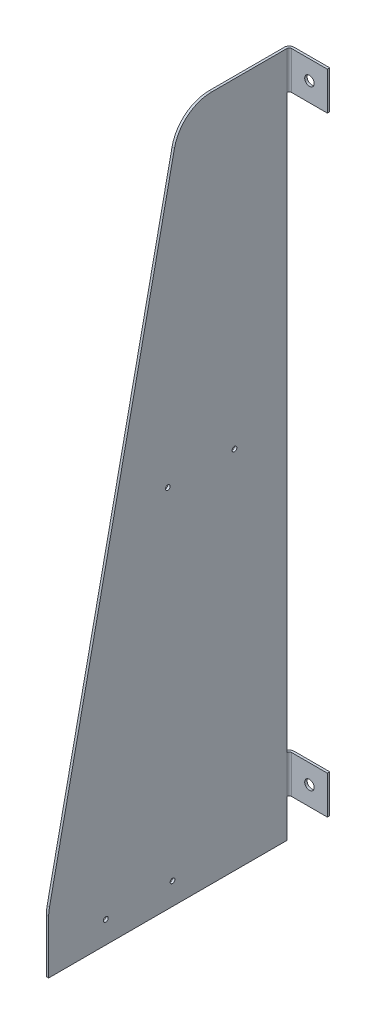
ISO-10303-21;
HEADER;
FILE_DESCRIPTION(('STEP AP214'),'2;1');
FILE_NAME('part.step','',(''),(''),'','','');
FILE_SCHEMA(('AUTOMOTIVE_DESIGN { 1 0 10303 214 1 1 1 1 }'));
ENDSEC;
DATA;
#1=APPLICATION_CONTEXT('core data for automotive mechanical design processes');
#2=APPLICATION_PROTOCOL_DEFINITION('international standard','automotive_design',2000,#1);
#3=PRODUCT_CONTEXT('',#1,'mechanical');
#4=PRODUCT('Part','Part','',(#3));
#5=PRODUCT_RELATED_PRODUCT_CATEGORY('part','',(#4));
#6=PRODUCT_DEFINITION_FORMATION('','',#4);
#7=PRODUCT_DEFINITION_CONTEXT('part definition',#1,'design');
#8=PRODUCT_DEFINITION('design','',#6,#7);
#9=PRODUCT_DEFINITION_SHAPE('','',#8);
#10=(LENGTH_UNIT() NAMED_UNIT(*) SI_UNIT(.MILLI.,.METRE.));
#11=(NAMED_UNIT(*) PLANE_ANGLE_UNIT() SI_UNIT($,.RADIAN.));
#12=(NAMED_UNIT(*) SI_UNIT($,.STERADIAN.) SOLID_ANGLE_UNIT());
#13=UNCERTAINTY_MEASURE_WITH_UNIT(LENGTH_MEASURE(1.E-05),#10,'distance_accuracy_value','');
#14=(GEOMETRIC_REPRESENTATION_CONTEXT(3) GLOBAL_UNCERTAINTY_ASSIGNED_CONTEXT((#13)) GLOBAL_UNIT_ASSIGNED_CONTEXT((#10,
#11,#12)) REPRESENTATION_CONTEXT('',''));
#15=CARTESIAN_POINT('',(0.,0.,0.));
#16=DIRECTION('',(0.,0.,1.));
#17=DIRECTION('',(1.,0.,0.));
#18=AXIS2_PLACEMENT_3D('',#15,#16,#17);
#19=CARTESIAN_POINT('',(3.175,0.,0.));
#20=DIRECTION('',(1.,0.,0.));
#21=DIRECTION('',(0.,0.,-1.));
#22=AXIS2_PLACEMENT_3D('',#19,#20,#21);
#23=PLANE('',#22);
#24=CARTESIAN_POINT('',(3.175,486.804131036418,69.85));
#25=DIRECTION('',(1.,0.,0.));
#26=DIRECTION('',(0.,0.,-1.));
#27=AXIS2_PLACEMENT_3D('',#24,#25,#26);
#28=CIRCLE('',#27,3.175);
#29=CARTESIAN_POINT('',(3.175,486.804131036418,66.675));
#30=VERTEX_POINT('',#29);
#31=EDGE_CURVE('E232',#30,#30,#28,.T.);
#32=ORIENTED_EDGE('',*,*,#31,.F.);
#33=EDGE_LOOP('',(#32));
#34=FACE_BOUND('',#33,.T.);
#35=CARTESIAN_POINT('',(3.175,29.604131036418,152.4));
#36=DIRECTION('',(1.,0.,0.));
#37=DIRECTION('',(0.,0.,-1.));
#38=AXIS2_PLACEMENT_3D('',#35,#36,#37);
#39=CIRCLE('',#38,3.175);
#40=CARTESIAN_POINT('',(3.175,29.604131036418,149.225));
#41=VERTEX_POINT('',#40);
#42=EDGE_CURVE('E236',#41,#41,#39,.T.);
#43=ORIENTED_EDGE('',*,*,#42,.F.);
#44=EDGE_LOOP('',(#43));
#45=FACE_BOUND('',#44,.T.);
#46=CARTESIAN_POINT('',(3.175,486.804131036418,158.75));
#47=DIRECTION('',(1.,0.,0.));
#48=DIRECTION('',(0.,0.,-1.));
#49=AXIS2_PLACEMENT_3D('',#46,#47,#48);
#50=CIRCLE('',#49,3.17499999999997);
#51=CARTESIAN_POINT('',(3.175,486.804131036418,155.575));
#52=VERTEX_POINT('',#51);
#53=EDGE_CURVE('E241',#52,#52,#50,.T.);
#54=ORIENTED_EDGE('',*,*,#53,.F.);
#55=EDGE_LOOP('',(#54));
#56=FACE_BOUND('',#55,.T.);
#57=CARTESIAN_POINT('',(3.175,29.604131036418,241.3));
#58=DIRECTION('',(1.,0.,0.));
#59=DIRECTION('',(0.,0.,-1.));
#60=AXIS2_PLACEMENT_3D('',#57,#58,#59);
#61=CIRCLE('',#60,3.17499999999997);
#62=CARTESIAN_POINT('',(3.175,29.604131036418,238.125));
#63=VERTEX_POINT('',#62);
#64=EDGE_CURVE('E276',#63,#63,#61,.T.);
#65=ORIENTED_EDGE('',*,*,#64,.F.);
#66=EDGE_LOOP('',(#65));
#67=FACE_BOUND('',#66,.T.);
#68=DIRECTION('',(0.,-1.,0.));
#69=VECTOR('',#68,1.);
#70=CARTESIAN_POINT('',(3.175,0.,-1.05760497574365E-13));
#71=LINE('',#70,#69);
#72=CARTESIAN_POINT('',(3.175,863.6,0.));
#73=VERTEX_POINT('',#72);
#74=CARTESIAN_POINT('',(3.175,101.6,0.));
#75=VERTEX_POINT('',#74);
#76=EDGE_CURVE('E268',#73,#75,#71,.T.);
#77=ORIENTED_EDGE('',*,*,#76,.F.);
#78=DIRECTION('',(0.,-1.,0.));
#79=VECTOR('',#78,1.);
#80=CARTESIAN_POINT('',(3.175,0.,0.));
#81=LINE('',#80,#79);
#82=CARTESIAN_POINT('',(3.175,914.4,0.));
#83=VERTEX_POINT('',#82);
#84=EDGE_CURVE('E368',#73,#83,#81,.F.);
#85=ORIENTED_EDGE('',*,*,#84,.T.);
#86=DIRECTION('',(0.,0.,-1.));
#87=VECTOR('',#86,1.);
#88=CARTESIAN_POINT('',(3.175,914.4,0.));
#89=LINE('',#88,#87);
#90=CARTESIAN_POINT('',(3.175,914.4,100.150182784968));
#91=VERTEX_POINT('',#90);
#92=EDGE_CURVE('E272',#91,#83,#89,.T.);
#93=ORIENTED_EDGE('',*,*,#92,.F.);
#94=CARTESIAN_POINT('',(3.175,863.6,100.150182784968));
#95=DIRECTION('',(1.,0.,0.));
#96=DIRECTION('',(0.,0.,-1.));
#97=AXIS2_PLACEMENT_3D('',#94,#95,#96);
#98=CIRCLE('',#97,50.8);
#99=CARTESIAN_POINT('',(3.175,874.045513000825,149.864680249487));
#100=VERTEX_POINT('',#99);
#101=EDGE_CURVE('E245',#100,#91,#98,.F.);
#102=ORIENTED_EDGE('',*,*,#101,.F.);
#103=DIRECTION('',(0.,-0.97863183985272,0.205620334661924));
#104=VECTOR('',#103,1.);
#105=CARTESIAN_POINT('',(3.175,67.1111623571902,319.409655665897));
#106=LINE('',#105,#104);
#107=CARTESIAN_POINT('',(3.175,81.3663535379903,316.414497464518));
#108=VERTEX_POINT('',#107);
#109=EDGE_CURVE('E249',#100,#108,#106,.T.);
#110=ORIENTED_EDGE('',*,*,#109,.T.);
#111=CARTESIAN_POINT('',(3.175,70.9208405371646,266.7));
#112=DIRECTION('',(1.,0.,0.));
#113=DIRECTION('',(0.,0.,-1.));
#114=AXIS2_PLACEMENT_3D('',#111,#112,#113);
#115=CIRCLE('',#114,50.8);
#116=CARTESIAN_POINT('',(3.175,70.9208405371646,317.5));
#117=VERTEX_POINT('',#116);
#118=EDGE_CURVE('E252',#117,#108,#115,.F.);
#119=ORIENTED_EDGE('',*,*,#118,.F.);
#120=DIRECTION('',(0.,1.,0.));
#121=VECTOR('',#120,1.);
#122=CARTESIAN_POINT('',(3.175,0.,317.5));
#123=LINE('',#122,#121);
#124=CARTESIAN_POINT('',(3.175,0.,317.5));
#125=VERTEX_POINT('',#124);
#126=EDGE_CURVE('E256',#125,#117,#123,.T.);
#127=ORIENTED_EDGE('',*,*,#126,.F.);
#128=DIRECTION('',(0.,0.,1.));
#129=VECTOR('',#128,1.);
#130=CARTESIAN_POINT('',(3.175,0.,0.));
#131=LINE('',#130,#129);
#132=CARTESIAN_POINT('',(3.175,0.,0.));
#133=VERTEX_POINT('',#132);
#134=EDGE_CURVE('E260',#133,#125,#131,.T.);
#135=ORIENTED_EDGE('',*,*,#134,.F.);
#136=DIRECTION('',(0.,1.,0.));
#137=VECTOR('',#136,1.);
#138=CARTESIAN_POINT('',(3.175,0.,0.));
#139=LINE('',#138,#137);
#140=CARTESIAN_POINT('',(3.175,50.8,0.));
#141=VERTEX_POINT('',#140);
#142=EDGE_CURVE('E264',#133,#141,#139,.T.);
#143=ORIENTED_EDGE('',*,*,#142,.T.);
#144=DIRECTION('',(0.,-1.,0.));
#145=VECTOR('',#144,1.);
#146=CARTESIAN_POINT('',(3.175,0.,0.));
#147=LINE('',#146,#145);
#148=EDGE_CURVE('E365',#141,#75,#147,.F.);
#149=ORIENTED_EDGE('',*,*,#148,.T.);
#150=EDGE_LOOP('',(#77,#85,#93,#102,#110,#119,#127,#135,#143,#149));
#151=FACE_BOUND('',#150,.T.);
#152=ADVANCED_FACE('F49',(#34,#45,#56,#67,#151),#23,.T.);
#153=CARTESIAN_POINT('',(3.175,863.6,100.150182784968));
#154=DIRECTION('',(-1.,0.,0.));
#155=DIRECTION('',(0.,0.,1.));
#156=AXIS2_PLACEMENT_3D('',#153,#154,#155);
#157=CYLINDRICAL_SURFACE('',#156,50.8);
#158=CARTESIAN_POINT('',(0.,863.6,100.150182784968));
#159=DIRECTION('',(1.,0.,0.));
#160=DIRECTION('',(0.,0.,-1.));
#161=AXIS2_PLACEMENT_3D('',#158,#159,#160);
#162=CIRCLE('',#161,50.8);
#163=CARTESIAN_POINT('',(0.,874.045513000825,149.864680249487));
#164=VERTEX_POINT('',#163);
#165=CARTESIAN_POINT('',(0.,914.4,100.150182784968));
#166=VERTEX_POINT('',#165);
#167=EDGE_CURVE('E292',#164,#166,#162,.F.);
#168=ORIENTED_EDGE('',*,*,#167,.F.);
#169=DIRECTION('',(-1.,0.,0.));
#170=VECTOR('',#169,1.);
#171=CARTESIAN_POINT('',(3.175,874.045513000825,149.864680249487));
#172=LINE('',#171,#170);
#173=EDGE_CURVE('E358',#100,#164,#172,.T.);
#174=ORIENTED_EDGE('',*,*,#173,.F.);
#175=ORIENTED_EDGE('',*,*,#101,.T.);
#176=DIRECTION('',(-1.,0.,0.));
#177=VECTOR('',#176,1.);
#178=CARTESIAN_POINT('',(3.175,914.4,100.150182784968));
#179=LINE('',#178,#177);
#180=EDGE_CURVE('E280',#91,#166,#179,.T.);
#181=ORIENTED_EDGE('',*,*,#180,.T.);
#182=EDGE_LOOP('',(#168,#174,#175,#181));
#183=FACE_BOUND('',#182,.T.);
#184=ADVANCED_FACE('F624',(#183),#157,.T.);
#185=CARTESIAN_POINT('',(3.175,67.1111623571902,319.409655665897));
#186=DIRECTION('',(0.,-0.205620334661924,-0.978631839852719));
#187=DIRECTION('',(0.,0.97863183985272,-0.205620334661924));
#188=AXIS2_PLACEMENT_3D('',#185,#186,#187);
#189=PLANE('',#188);
#190=DIRECTION('',(0.,-0.97863183985272,0.205620334661924));
#191=VECTOR('',#190,1.);
#192=CARTESIAN_POINT('',(0.,67.1111623571902,319.409655665897));
#193=LINE('',#192,#191);
#194=CARTESIAN_POINT('',(0.,81.3663535379903,316.414497464518));
#195=VERTEX_POINT('',#194);
#196=EDGE_CURVE('E296',#164,#195,#193,.T.);
#197=ORIENTED_EDGE('',*,*,#196,.T.);
#198=DIRECTION('',(-1.,0.,0.));
#199=VECTOR('',#198,1.);
#200=CARTESIAN_POINT('',(3.175,81.3663535379903,316.414497464518));
#201=LINE('',#200,#199);
#202=EDGE_CURVE('E355',#108,#195,#201,.T.);
#203=ORIENTED_EDGE('',*,*,#202,.F.);
#204=ORIENTED_EDGE('',*,*,#109,.F.);
#205=ORIENTED_EDGE('',*,*,#173,.T.);
#206=EDGE_LOOP('',(#197,#203,#204,#205));
#207=FACE_BOUND('',#206,.T.);
#208=ADVANCED_FACE('F631',(#207),#189,.F.);
#209=CARTESIAN_POINT('',(3.175,70.9208405371646,266.7));
#210=DIRECTION('',(-1.,0.,0.));
#211=DIRECTION('',(0.,0.,1.));
#212=AXIS2_PLACEMENT_3D('',#209,#210,#211);
#213=CYLINDRICAL_SURFACE('',#212,50.8);
#214=CARTESIAN_POINT('',(0.,70.9208405371646,266.7));
#215=DIRECTION('',(1.,0.,0.));
#216=DIRECTION('',(0.,0.,-1.));
#217=AXIS2_PLACEMENT_3D('',#214,#215,#216);
#218=CIRCLE('',#217,50.8);
#219=CARTESIAN_POINT('',(0.,70.9208405371646,317.5));
#220=VERTEX_POINT('',#219);
#221=EDGE_CURVE('E300',#220,#195,#218,.F.);
#222=ORIENTED_EDGE('',*,*,#221,.F.);
#223=DIRECTION('',(-1.,0.,0.));
#224=VECTOR('',#223,1.);
#225=CARTESIAN_POINT('',(3.175,70.9208405371646,317.5));
#226=LINE('',#225,#224);
#227=EDGE_CURVE('E352',#117,#220,#226,.T.);
#228=ORIENTED_EDGE('',*,*,#227,.F.);
#229=ORIENTED_EDGE('',*,*,#118,.T.);
#230=ORIENTED_EDGE('',*,*,#202,.T.);
#231=EDGE_LOOP('',(#222,#228,#229,#230));
#232=FACE_BOUND('',#231,.T.);
#233=ADVANCED_FACE('F675',(#232),#213,.T.);
#234=CARTESIAN_POINT('',(3.175,0.,317.5));
#235=DIRECTION('',(0.,0.,1.));
#236=DIRECTION('',(1.,0.,0.));
#237=AXIS2_PLACEMENT_3D('',#234,#235,#236);
#238=PLANE('',#237);
#239=DIRECTION('',(0.,1.,0.));
#240=VECTOR('',#239,1.);
#241=CARTESIAN_POINT('',(0.,0.,317.5));
#242=LINE('',#241,#240);
#243=CARTESIAN_POINT('',(0.,0.,317.5));
#244=VERTEX_POINT('',#243);
#245=EDGE_CURVE('E304',#244,#220,#242,.T.);
#246=ORIENTED_EDGE('',*,*,#245,.F.);
#247=DIRECTION('',(-1.,0.,0.));
#248=VECTOR('',#247,1.);
#249=CARTESIAN_POINT('',(3.175,0.,317.5));
#250=LINE('',#249,#248);
#251=EDGE_CURVE('E349',#125,#244,#250,.T.);
#252=ORIENTED_EDGE('',*,*,#251,.F.);
#253=ORIENTED_EDGE('',*,*,#126,.T.);
#254=ORIENTED_EDGE('',*,*,#227,.T.);
#255=EDGE_LOOP('',(#246,#252,#253,#254));
#256=FACE_BOUND('',#255,.T.);
#257=ADVANCED_FACE('F671',(#256),#238,.T.);
#258=CARTESIAN_POINT('',(3.175,0.,0.));
#259=DIRECTION('',(0.,-1.,0.));
#260=DIRECTION('',(0.,0.,-1.));
#261=AXIS2_PLACEMENT_3D('',#258,#259,#260);
#262=PLANE('',#261);
#263=DIRECTION('',(0.,0.,1.));
#264=VECTOR('',#263,1.);
#265=CARTESIAN_POINT('',(0.,0.,0.));
#266=LINE('',#265,#264);
#267=CARTESIAN_POINT('',(0.,0.,0.));
#268=VERTEX_POINT('',#267);
#269=EDGE_CURVE('E308',#268,#244,#266,.T.);
#270=ORIENTED_EDGE('',*,*,#269,.F.);
#271=DIRECTION('',(-1.,0.,0.));
#272=VECTOR('',#271,1.);
#273=CARTESIAN_POINT('',(3.175,0.,0.));
#274=LINE('',#273,#272);
#275=EDGE_CURVE('E346',#133,#268,#274,.T.);
#276=ORIENTED_EDGE('',*,*,#275,.F.);
#277=ORIENTED_EDGE('',*,*,#134,.T.);
#278=ORIENTED_EDGE('',*,*,#251,.T.);
#279=EDGE_LOOP('',(#270,#276,#277,#278));
#280=FACE_BOUND('',#279,.T.);
#281=ADVANCED_FACE('F667',(#280),#262,.T.);
#282=CARTESIAN_POINT('',(3.175,0.,0.));
#283=DIRECTION('',(0.,0.,1.));
#284=DIRECTION('',(1.,0.,0.));
#285=AXIS2_PLACEMENT_3D('',#282,#283,#284);
#286=PLANE('',#285);
#287=DIRECTION('',(0.,1.,0.));
#288=VECTOR('',#287,1.);
#289=CARTESIAN_POINT('',(0.,0.,0.));
#290=LINE('',#289,#288);
#291=CARTESIAN_POINT('',(0.,50.8,0.));
#292=VERTEX_POINT('',#291);
#293=EDGE_CURVE('E312',#268,#292,#290,.T.);
#294=ORIENTED_EDGE('',*,*,#293,.T.);
#295=DIRECTION('',(-1.,0.,0.));
#296=VECTOR('',#295,1.);
#297=CARTESIAN_POINT('',(3.175,50.8,0.));
#298=LINE('',#297,#296);
#299=EDGE_CURVE('E184',#141,#292,#298,.T.);
#300=ORIENTED_EDGE('',*,*,#299,.F.);
#301=ORIENTED_EDGE('',*,*,#142,.F.);
#302=ORIENTED_EDGE('',*,*,#275,.T.);
#303=EDGE_LOOP('',(#294,#300,#301,#302));
#304=FACE_BOUND('',#303,.T.);
#305=ADVANCED_FACE('F665',(#304),#286,.F.);
#306=CARTESIAN_POINT('',(3.175,50.8,0.));
#307=DIRECTION('',(0.,-1.,0.));
#308=DIRECTION('',(0.,0.,-1.));
#309=AXIS2_PLACEMENT_3D('',#306,#307,#308);
#310=PLANE('',#309);
#311=ORIENTED_EDGE('',*,*,#299,.T.);
#312=CARTESIAN_POINT('',(6.35,50.8,0.));
#313=DIRECTION('',(0.,-1.,0.));
#314=DIRECTION('',(0.,0.,-1.));
#315=AXIS2_PLACEMENT_3D('',#312,#313,#314);
#316=CIRCLE('',#315,6.35);
#317=CARTESIAN_POINT('',(6.35,50.8,-6.35));
#318=VERTEX_POINT('',#317);
#319=EDGE_CURVE('E179',#292,#318,#316,.T.);
#320=ORIENTED_EDGE('',*,*,#319,.T.);
#321=DIRECTION('',(-1.,0.,0.));
#322=VECTOR('',#321,1.);
#323=CARTESIAN_POINT('',(3.175,50.8,-6.35));
#324=LINE('',#323,#322);
#325=CARTESIAN_POINT('',(53.975,50.8,-6.35));
#326=VERTEX_POINT('',#325);
#327=EDGE_CURVE('E173',#326,#318,#324,.T.);
#328=ORIENTED_EDGE('',*,*,#327,.F.);
#329=DIRECTION('',(0.,0.,-1.));
#330=VECTOR('',#329,1.);
#331=CARTESIAN_POINT('',(53.975,50.8,-6.35));
#332=LINE('',#331,#330);
#333=CARTESIAN_POINT('',(53.975,50.8,-3.175));
#334=VERTEX_POINT('',#333);
#335=EDGE_CURVE('E178',#334,#326,#332,.T.);
#336=ORIENTED_EDGE('',*,*,#335,.F.);
#337=DIRECTION('',(-1.,0.,0.));
#338=VECTOR('',#337,1.);
#339=CARTESIAN_POINT('',(53.975,50.8,-3.175));
#340=LINE('',#339,#338);
#341=CARTESIAN_POINT('',(6.35,50.8,-3.175));
#342=VERTEX_POINT('',#341);
#343=EDGE_CURVE('E195',#334,#342,#340,.T.);
#344=ORIENTED_EDGE('',*,*,#343,.T.);
#345=CARTESIAN_POINT('',(6.35,50.8,0.));
#346=DIRECTION('',(0.,-1.,0.));
#347=DIRECTION('',(0.,0.,-1.));
#348=AXIS2_PLACEMENT_3D('',#345,#346,#347);
#349=CIRCLE('',#348,3.175);
#350=EDGE_CURVE('E381',#342,#141,#349,.F.);
#351=ORIENTED_EDGE('',*,*,#350,.T.);
#352=EDGE_LOOP('',(#311,#320,#328,#336,#344,#351));
#353=FACE_BOUND('',#352,.T.);
#354=ADVANCED_FACE('F176',(#353),#310,.T.);
#355=CARTESIAN_POINT('',(3.175,0.,-6.35000000000001));
#356=DIRECTION('',(0.,0.,-1.));
#357=DIRECTION('',(0.,1.,0.));
#358=AXIS2_PLACEMENT_3D('',#355,#356,#357);
#359=PLANE('',#358);
#360=CARTESIAN_POINT('',(30.1625,76.2,-6.35));
#361=DIRECTION('',(0.,0.,1.));
#362=DIRECTION('',(1.,0.,0.));
#363=AXIS2_PLACEMENT_3D('',#360,#361,#362);
#364=CIRCLE('',#363,6.35);
#365=CARTESIAN_POINT('',(36.5125,76.2,-6.35));
#366=VERTEX_POINT('',#365);
#367=EDGE_CURVE('E539',#366,#366,#364,.T.);
#368=ORIENTED_EDGE('',*,*,#367,.T.);
#369=EDGE_LOOP('',(#368));
#370=FACE_BOUND('',#369,.T.);
#371=ORIENTED_EDGE('',*,*,#327,.T.);
#372=DIRECTION('',(0.,-1.,0.));
#373=VECTOR('',#372,1.);
#374=CARTESIAN_POINT('',(6.35,101.6,-6.34999999999999));
#375=LINE('',#374,#373);
#376=CARTESIAN_POINT('',(6.35,101.6,-6.34999999999999));
#377=VERTEX_POINT('',#376);
#378=EDGE_CURVE('E397',#318,#377,#375,.F.);
#379=ORIENTED_EDGE('',*,*,#378,.T.);
#380=DIRECTION('',(-1.,0.,0.));
#381=VECTOR('',#380,1.);
#382=CARTESIAN_POINT('',(3.175,101.6,-6.34999999999999));
#383=LINE('',#382,#381);
#384=CARTESIAN_POINT('',(53.975,101.6,-6.34999999999999));
#385=VERTEX_POINT('',#384);
#386=EDGE_CURVE('E185',#385,#377,#383,.T.);
#387=ORIENTED_EDGE('',*,*,#386,.F.);
#388=DIRECTION('',(0.,1.,0.));
#389=VECTOR('',#388,1.);
#390=CARTESIAN_POINT('',(53.975,101.6,-6.34999999999999));
#391=LINE('',#390,#389);
#392=EDGE_CURVE('E190',#326,#385,#391,.T.);
#393=ORIENTED_EDGE('',*,*,#392,.F.);
#394=EDGE_LOOP('',(#371,#379,#387,#393));
#395=FACE_BOUND('',#394,.T.);
#396=ADVANCED_FACE('F197',(#370,#395),#359,.T.);
#397=CARTESIAN_POINT('',(3.175,101.6,0.));
#398=DIRECTION('',(0.,1.,0.));
#399=DIRECTION('',(0.,0.,1.));
#400=AXIS2_PLACEMENT_3D('',#397,#398,#399);
#401=PLANE('',#400);
#402=ORIENTED_EDGE('',*,*,#386,.T.);
#403=CARTESIAN_POINT('',(6.35,101.6,0.));
#404=DIRECTION('',(0.,1.,0.));
#405=DIRECTION('',(0.,0.,1.));
#406=AXIS2_PLACEMENT_3D('',#403,#404,#405);
#407=CIRCLE('',#406,6.35);
#408=CARTESIAN_POINT('',(0.,101.6,0.));
#409=VERTEX_POINT('',#408);
#410=EDGE_CURVE('E400',#377,#409,#407,.T.);
#411=ORIENTED_EDGE('',*,*,#410,.T.);
#412=DIRECTION('',(-1.,0.,0.));
#413=VECTOR('',#412,1.);
#414=CARTESIAN_POINT('',(3.175,101.6,0.));
#415=LINE('',#414,#413);
#416=EDGE_CURVE('E338',#75,#409,#415,.T.);
#417=ORIENTED_EDGE('',*,*,#416,.F.);
#418=CARTESIAN_POINT('',(6.35,101.6,0.));
#419=DIRECTION('',(0.,1.,0.));
#420=DIRECTION('',(0.,0.,1.));
#421=AXIS2_PLACEMENT_3D('',#418,#419,#420);
#422=CIRCLE('',#421,3.175);
#423=CARTESIAN_POINT('',(6.35,101.6,-3.17499999999999));
#424=VERTEX_POINT('',#423);
#425=EDGE_CURVE('E384',#75,#424,#422,.F.);
#426=ORIENTED_EDGE('',*,*,#425,.T.);
#427=DIRECTION('',(-1.,0.,0.));
#428=VECTOR('',#427,1.);
#429=CARTESIAN_POINT('',(53.975,101.6,-3.17499999999999));
#430=LINE('',#429,#428);
#431=CARTESIAN_POINT('',(53.975,101.6,-3.17499999999999));
#432=VERTEX_POINT('',#431);
#433=EDGE_CURVE('E533',#432,#424,#430,.T.);
#434=ORIENTED_EDGE('',*,*,#433,.F.);
#435=DIRECTION('',(0.,0.,1.));
#436=VECTOR('',#435,1.);
#437=CARTESIAN_POINT('',(53.975,101.6,-6.34999999999999));
#438=LINE('',#437,#436);
#439=EDGE_CURVE('E202',#385,#432,#438,.T.);
#440=ORIENTED_EDGE('',*,*,#439,.F.);
#441=EDGE_LOOP('',(#402,#411,#417,#426,#434,#440));
#442=FACE_BOUND('',#441,.T.);
#443=ADVANCED_FACE('F601',(#442),#401,.T.);
#444=CARTESIAN_POINT('',(3.175,0.,-1.05760497574365E-13));
#445=DIRECTION('',(0.,0.,-1.));
#446=DIRECTION('',(0.,1.,0.));
#447=AXIS2_PLACEMENT_3D('',#444,#445,#446);
#448=PLANE('',#447);
#449=DIRECTION('',(0.,-1.,0.));
#450=VECTOR('',#449,1.);
#451=CARTESIAN_POINT('',(0.,0.,-1.05760497574365E-13));
#452=LINE('',#451,#450);
#453=CARTESIAN_POINT('',(0.,863.6,0.));
#454=VERTEX_POINT('',#453);
#455=EDGE_CURVE('E316',#454,#409,#452,.T.);
#456=ORIENTED_EDGE('',*,*,#455,.F.);
#457=DIRECTION('',(-1.,0.,0.));
#458=VECTOR('',#457,1.);
#459=CARTESIAN_POINT('',(3.175,863.6,0.));
#460=LINE('',#459,#458);
#461=EDGE_CURVE('E335',#73,#454,#460,.T.);
#462=ORIENTED_EDGE('',*,*,#461,.F.);
#463=ORIENTED_EDGE('',*,*,#76,.T.);
#464=ORIENTED_EDGE('',*,*,#416,.T.);
#465=EDGE_LOOP('',(#456,#462,#463,#464));
#466=FACE_BOUND('',#465,.T.);
#467=ADVANCED_FACE('F590',(#466),#448,.T.);
#468=CARTESIAN_POINT('',(3.175,863.6,0.));
#469=DIRECTION('',(0.,-1.,0.));
#470=DIRECTION('',(0.,0.,-1.));
#471=AXIS2_PLACEMENT_3D('',#468,#469,#470);
#472=PLANE('',#471);
#473=ORIENTED_EDGE('',*,*,#461,.T.);
#474=CARTESIAN_POINT('',(6.35,863.6,0.));
#475=DIRECTION('',(0.,-1.,0.));
#476=DIRECTION('',(0.,0.,-1.));
#477=AXIS2_PLACEMENT_3D('',#474,#475,#476);
#478=CIRCLE('',#477,6.35);
#479=CARTESIAN_POINT('',(6.35,863.6,-6.35));
#480=VERTEX_POINT('',#479);
#481=EDGE_CURVE('E72',#454,#480,#478,.T.);
#482=ORIENTED_EDGE('',*,*,#481,.T.);
#483=DIRECTION('',(-1.,0.,0.));
#484=VECTOR('',#483,1.);
#485=CARTESIAN_POINT('',(3.175,863.6,-6.35));
#486=LINE('',#485,#484);
#487=CARTESIAN_POINT('',(53.975,863.6,-6.34999999999999));
#488=VERTEX_POINT('',#487);
#489=EDGE_CURVE('E332',#488,#480,#486,.T.);
#490=ORIENTED_EDGE('',*,*,#489,.F.);
#491=DIRECTION('',(0.,0.,-1.));
#492=VECTOR('',#491,1.);
#493=CARTESIAN_POINT('',(53.975,863.6,-6.34999999999999));
#494=LINE('',#493,#492);
#495=CARTESIAN_POINT('',(53.975,863.6,-3.175));
#496=VERTEX_POINT('',#495);
#497=EDGE_CURVE('E219',#496,#488,#494,.T.);
#498=ORIENTED_EDGE('',*,*,#497,.F.);
#499=DIRECTION('',(-1.,0.,0.));
#500=VECTOR('',#499,1.);
#501=CARTESIAN_POINT('',(53.975,863.6,-3.175));
#502=LINE('',#501,#500);
#503=CARTESIAN_POINT('',(6.35,863.6,-3.175));
#504=VERTEX_POINT('',#503);
#505=EDGE_CURVE('E223',#496,#504,#502,.T.);
#506=ORIENTED_EDGE('',*,*,#505,.T.);
#507=CARTESIAN_POINT('',(6.35,863.6,0.));
#508=DIRECTION('',(0.,-1.,0.));
#509=DIRECTION('',(0.,0.,-1.));
#510=AXIS2_PLACEMENT_3D('',#507,#508,#509);
#511=CIRCLE('',#510,3.175);
#512=EDGE_CURVE('E375',#504,#73,#511,.F.);
#513=ORIENTED_EDGE('',*,*,#512,.T.);
#514=EDGE_LOOP('',(#473,#482,#490,#498,#506,#513));
#515=FACE_BOUND('',#514,.T.);
#516=ADVANCED_FACE('F585',(#515),#472,.T.);
#517=CARTESIAN_POINT('',(3.175,0.,-6.35000000000009));
#518=DIRECTION('',(0.,0.,-1.));
#519=DIRECTION('',(0.,1.,0.));
#520=AXIS2_PLACEMENT_3D('',#517,#518,#519);
#521=PLANE('',#520);
#522=CARTESIAN_POINT('',(30.1625,889.,-6.35));
#523=DIRECTION('',(0.,0.,1.));
#524=DIRECTION('',(1.,0.,0.));
#525=AXIS2_PLACEMENT_3D('',#522,#523,#524);
#526=CIRCLE('',#525,6.35);
#527=CARTESIAN_POINT('',(36.5125,889.,-6.35));
#528=VERTEX_POINT('',#527);
#529=EDGE_CURVE('E551',#528,#528,#526,.T.);
#530=ORIENTED_EDGE('',*,*,#529,.T.);
#531=EDGE_LOOP('',(#530));
#532=FACE_BOUND('',#531,.T.);
#533=ORIENTED_EDGE('',*,*,#489,.T.);
#534=DIRECTION('',(0.,-1.,0.));
#535=VECTOR('',#534,1.);
#536=CARTESIAN_POINT('',(6.35,914.4,-6.34999999999999));
#537=LINE('',#536,#535);
#538=CARTESIAN_POINT('',(6.35,914.4,-6.34999999999999));
#539=VERTEX_POINT('',#538);
#540=EDGE_CURVE('E58',#480,#539,#537,.F.);
#541=ORIENTED_EDGE('',*,*,#540,.T.);
#542=DIRECTION('',(-1.,0.,0.));
#543=VECTOR('',#542,1.);
#544=CARTESIAN_POINT('',(3.175,914.4,-6.34999999999999));
#545=LINE('',#544,#543);
#546=CARTESIAN_POINT('',(53.975,914.4,-6.34999999999999));
#547=VERTEX_POINT('',#546);
#548=EDGE_CURVE('E329',#547,#539,#545,.T.);
#549=ORIENTED_EDGE('',*,*,#548,.F.);
#550=DIRECTION('',(0.,1.,0.));
#551=VECTOR('',#550,1.);
#552=CARTESIAN_POINT('',(53.975,914.4,-6.34999999999999));
#553=LINE('',#552,#551);
#554=EDGE_CURVE('E201',#488,#547,#553,.T.);
#555=ORIENTED_EDGE('',*,*,#554,.F.);
#556=EDGE_LOOP('',(#533,#541,#549,#555));
#557=FACE_BOUND('',#556,.T.);
#558=ADVANCED_FACE('F650',(#532,#557),#521,.T.);
#559=CARTESIAN_POINT('',(3.175,914.4,0.));
#560=DIRECTION('',(0.,1.,0.));
#561=DIRECTION('',(0.,0.,1.));
#562=AXIS2_PLACEMENT_3D('',#559,#560,#561);
#563=PLANE('',#562);
#564=ORIENTED_EDGE('',*,*,#548,.T.);
#565=CARTESIAN_POINT('',(6.35,914.4,0.));
#566=DIRECTION('',(0.,1.,0.));
#567=DIRECTION('',(0.,0.,1.));
#568=AXIS2_PLACEMENT_3D('',#565,#566,#567);
#569=CIRCLE('',#568,6.35);
#570=CARTESIAN_POINT('',(0.,914.4,0.));
#571=VERTEX_POINT('',#570);
#572=EDGE_CURVE('E11',#539,#571,#569,.T.);
#573=ORIENTED_EDGE('',*,*,#572,.T.);
#574=DIRECTION('',(0.,0.,-1.));
#575=VECTOR('',#574,1.);
#576=CARTESIAN_POINT('',(0.,914.4,0.));
#577=LINE('',#576,#575);
#578=EDGE_CURVE('E320',#166,#571,#577,.T.);
#579=ORIENTED_EDGE('',*,*,#578,.F.);
#580=ORIENTED_EDGE('',*,*,#180,.F.);
#581=ORIENTED_EDGE('',*,*,#92,.T.);
#582=CARTESIAN_POINT('',(6.35,914.4,0.));
#583=DIRECTION('',(0.,1.,0.));
#584=DIRECTION('',(0.,0.,1.));
#585=AXIS2_PLACEMENT_3D('',#582,#583,#584);
#586=CIRCLE('',#585,3.175);
#587=CARTESIAN_POINT('',(6.35,914.4,-3.175));
#588=VERTEX_POINT('',#587);
#589=EDGE_CURVE('E378',#83,#588,#586,.F.);
#590=ORIENTED_EDGE('',*,*,#589,.T.);
#591=DIRECTION('',(-1.,0.,0.));
#592=VECTOR('',#591,1.);
#593=CARTESIAN_POINT('',(53.975,914.4,-3.175));
#594=LINE('',#593,#592);
#595=CARTESIAN_POINT('',(53.975,914.4,-3.175));
#596=VERTEX_POINT('',#595);
#597=EDGE_CURVE('E227',#596,#588,#594,.T.);
#598=ORIENTED_EDGE('',*,*,#597,.F.);
#599=DIRECTION('',(0.,0.,1.));
#600=VECTOR('',#599,1.);
#601=CARTESIAN_POINT('',(53.975,914.4,-6.34999999999999));
#602=LINE('',#601,#600);
#603=EDGE_CURVE('E209',#547,#596,#602,.T.);
#604=ORIENTED_EDGE('',*,*,#603,.F.);
#605=EDGE_LOOP('',(#564,#573,#579,#580,#581,#590,#598,#604));
#606=FACE_BOUND('',#605,.T.);
#607=ADVANCED_FACE('F646',(#606),#563,.T.);
#608=CARTESIAN_POINT('',(3.175,486.804131036418,158.75));
#609=DIRECTION('',(-1.,0.,0.));
#610=DIRECTION('',(0.,0.,1.));
#611=AXIS2_PLACEMENT_3D('',#608,#609,#610);
#612=CYLINDRICAL_SURFACE('',#611,3.17499999999997);
#613=ORIENTED_EDGE('',*,*,#53,.T.);
#614=EDGE_LOOP('',(#613));
#615=FACE_BOUND('',#614,.T.);
#616=CARTESIAN_POINT('',(0.,486.804131036418,158.75));
#617=DIRECTION('',(1.,0.,0.));
#618=DIRECTION('',(0.,0.,-1.));
#619=AXIS2_PLACEMENT_3D('',#616,#617,#618);
#620=CIRCLE('',#619,3.17499999999997);
#621=CARTESIAN_POINT('',(0.,486.804131036418,155.575));
#622=VERTEX_POINT('',#621);
#623=EDGE_CURVE('E288',#622,#622,#620,.T.);
#624=ORIENTED_EDGE('',*,*,#623,.F.);
#625=EDGE_LOOP('',(#624));
#626=FACE_BOUND('',#625,.T.);
#627=ADVANCED_FACE('F649',(#615,#626),#612,.F.);
#628=CARTESIAN_POINT('',(3.175,29.604131036418,152.4));
#629=DIRECTION('',(-1.,0.,0.));
#630=DIRECTION('',(0.,0.,1.));
#631=AXIS2_PLACEMENT_3D('',#628,#629,#630);
#632=CYLINDRICAL_SURFACE('',#631,3.175);
#633=ORIENTED_EDGE('',*,*,#42,.T.);
#634=EDGE_LOOP('',(#633));
#635=FACE_BOUND('',#634,.T.);
#636=CARTESIAN_POINT('',(0.,29.604131036418,152.4));
#637=DIRECTION('',(1.,0.,0.));
#638=DIRECTION('',(0.,0.,-1.));
#639=AXIS2_PLACEMENT_3D('',#636,#637,#638);
#640=CIRCLE('',#639,3.175);
#641=CARTESIAN_POINT('',(0.,29.604131036418,149.225));
#642=VERTEX_POINT('',#641);
#643=EDGE_CURVE('E284',#642,#642,#640,.T.);
#644=ORIENTED_EDGE('',*,*,#643,.F.);
#645=EDGE_LOOP('',(#644));
#646=FACE_BOUND('',#645,.T.);
#647=ADVANCED_FACE('F685',(#635,#646),#632,.F.);
#648=CARTESIAN_POINT('',(3.175,486.804131036418,69.85));
#649=DIRECTION('',(-1.,0.,0.));
#650=DIRECTION('',(0.,0.,1.));
#651=AXIS2_PLACEMENT_3D('',#648,#649,#650);
#652=CYLINDRICAL_SURFACE('',#651,3.175);
#653=ORIENTED_EDGE('',*,*,#31,.T.);
#654=EDGE_LOOP('',(#653));
#655=FACE_BOUND('',#654,.T.);
#656=CARTESIAN_POINT('',(0.,486.804131036418,69.85));
#657=DIRECTION('',(1.,0.,0.));
#658=DIRECTION('',(0.,0.,-1.));
#659=AXIS2_PLACEMENT_3D('',#656,#657,#658);
#660=CIRCLE('',#659,3.175);
#661=CARTESIAN_POINT('',(0.,486.804131036418,66.675));
#662=VERTEX_POINT('',#661);
#663=EDGE_CURVE('E231',#662,#662,#660,.T.);
#664=ORIENTED_EDGE('',*,*,#663,.F.);
#665=EDGE_LOOP('',(#664));
#666=FACE_BOUND('',#665,.T.);
#667=ADVANCED_FACE('F644',(#655,#666),#652,.F.);
#668=CARTESIAN_POINT('',(3.175,29.604131036418,241.3));
#669=DIRECTION('',(-1.,0.,0.));
#670=DIRECTION('',(0.,0.,1.));
#671=AXIS2_PLACEMENT_3D('',#668,#669,#670);
#672=CYLINDRICAL_SURFACE('',#671,3.17499999999997);
#673=ORIENTED_EDGE('',*,*,#64,.T.);
#674=EDGE_LOOP('',(#673));
#675=FACE_BOUND('',#674,.T.);
#676=CARTESIAN_POINT('',(0.,29.604131036418,241.3));
#677=DIRECTION('',(1.,0.,0.));
#678=DIRECTION('',(0.,0.,-1.));
#679=AXIS2_PLACEMENT_3D('',#676,#677,#678);
#680=CIRCLE('',#679,3.17499999999997);
#681=CARTESIAN_POINT('',(0.,29.604131036418,238.125));
#682=VERTEX_POINT('',#681);
#683=EDGE_CURVE('E237',#682,#682,#680,.T.);
#684=ORIENTED_EDGE('',*,*,#683,.F.);
#685=EDGE_LOOP('',(#684));
#686=FACE_BOUND('',#685,.T.);
#687=ADVANCED_FACE('F640',(#675,#686),#672,.F.);
#688=CARTESIAN_POINT('',(0.,0.,0.));
#689=DIRECTION('',(1.,0.,0.));
#690=DIRECTION('',(0.,0.,-1.));
#691=AXIS2_PLACEMENT_3D('',#688,#689,#690);
#692=PLANE('',#691);
#693=ORIENTED_EDGE('',*,*,#663,.T.);
#694=EDGE_LOOP('',(#693));
#695=FACE_BOUND('',#694,.T.);
#696=ORIENTED_EDGE('',*,*,#643,.T.);
#697=EDGE_LOOP('',(#696));
#698=FACE_BOUND('',#697,.T.);
#699=ORIENTED_EDGE('',*,*,#623,.T.);
#700=EDGE_LOOP('',(#699));
#701=FACE_BOUND('',#700,.T.);
#702=ORIENTED_EDGE('',*,*,#455,.T.);
#703=DIRECTION('',(0.,-1.,0.));
#704=VECTOR('',#703,1.);
#705=CARTESIAN_POINT('',(0.,50.8,0.));
#706=LINE('',#705,#704);
#707=EDGE_CURVE('E391',#409,#292,#706,.T.);
#708=ORIENTED_EDGE('',*,*,#707,.T.);
#709=ORIENTED_EDGE('',*,*,#293,.F.);
#710=ORIENTED_EDGE('',*,*,#269,.T.);
#711=ORIENTED_EDGE('',*,*,#245,.T.);
#712=ORIENTED_EDGE('',*,*,#221,.T.);
#713=ORIENTED_EDGE('',*,*,#196,.F.);
#714=ORIENTED_EDGE('',*,*,#167,.T.);
#715=ORIENTED_EDGE('',*,*,#578,.T.);
#716=DIRECTION('',(0.,-1.,0.));
#717=VECTOR('',#716,1.);
#718=CARTESIAN_POINT('',(0.,863.6,0.));
#719=LINE('',#718,#717);
#720=EDGE_CURVE('E387',#571,#454,#719,.T.);
#721=ORIENTED_EDGE('',*,*,#720,.T.);
#722=EDGE_LOOP('',(#702,#708,#709,#710,#711,#712,#713,#714,#715,#721));
#723=FACE_BOUND('',#722,.T.);
#724=ORIENTED_EDGE('',*,*,#683,.T.);
#725=EDGE_LOOP('',(#724));
#726=FACE_BOUND('',#725,.T.);
#727=ADVANCED_FACE('F572',(#695,#698,#701,#723,#726),#692,.F.);
#728=CARTESIAN_POINT('',(53.975,914.4,-3.175));
#729=DIRECTION('',(0.,0.,-1.));
#730=DIRECTION('',(-1.,0.,0.));
#731=AXIS2_PLACEMENT_3D('',#728,#729,#730);
#732=PLANE('',#731);
#733=CARTESIAN_POINT('',(30.1625,889.,-3.175));
#734=DIRECTION('',(0.,0.,1.));
#735=DIRECTION('',(1.,0.,0.));
#736=AXIS2_PLACEMENT_3D('',#733,#734,#735);
#737=CIRCLE('',#736,6.34999999999999);
#738=CARTESIAN_POINT('',(36.5125,889.,-3.175));
#739=VERTEX_POINT('',#738);
#740=EDGE_CURVE('E557',#739,#739,#737,.T.);
#741=ORIENTED_EDGE('',*,*,#740,.F.);
#742=EDGE_LOOP('',(#741));
#743=FACE_BOUND('',#742,.T.);
#744=ORIENTED_EDGE('',*,*,#597,.T.);
#745=DIRECTION('',(0.,-1.,0.));
#746=VECTOR('',#745,1.);
#747=CARTESIAN_POINT('',(6.35,914.4,-3.175));
#748=LINE('',#747,#746);
#749=EDGE_CURVE('E361',#588,#504,#748,.T.);
#750=ORIENTED_EDGE('',*,*,#749,.T.);
#751=ORIENTED_EDGE('',*,*,#505,.F.);
#752=DIRECTION('',(0.,-1.,0.));
#753=VECTOR('',#752,1.);
#754=CARTESIAN_POINT('',(53.975,914.4,-3.175));
#755=LINE('',#754,#753);
#756=EDGE_CURVE('E216',#596,#496,#755,.T.);
#757=ORIENTED_EDGE('',*,*,#756,.F.);
#758=EDGE_LOOP('',(#744,#750,#751,#757));
#759=FACE_BOUND('',#758,.T.);
#760=ADVANCED_FACE('F568',(#743,#759),#732,.F.);
#761=CARTESIAN_POINT('',(53.975,0.,0.));
#762=DIRECTION('',(-1.,0.,0.));
#763=DIRECTION('',(0.,0.,1.));
#764=AXIS2_PLACEMENT_3D('',#761,#762,#763);
#765=PLANE('',#764);
#766=ORIENTED_EDGE('',*,*,#554,.T.);
#767=ORIENTED_EDGE('',*,*,#603,.T.);
#768=ORIENTED_EDGE('',*,*,#756,.T.);
#769=ORIENTED_EDGE('',*,*,#497,.T.);
#770=EDGE_LOOP('',(#766,#767,#768,#769));
#771=FACE_BOUND('',#770,.T.);
#772=ADVANCED_FACE('F571',(#771),#765,.F.);
#773=CARTESIAN_POINT('',(53.975,101.6,-3.17499999999999));
#774=DIRECTION('',(0.,0.,-1.));
#775=DIRECTION('',(0.,1.,0.));
#776=AXIS2_PLACEMENT_3D('',#773,#774,#775);
#777=PLANE('',#776);
#778=CARTESIAN_POINT('',(30.1625,76.2,-3.175));
#779=DIRECTION('',(0.,0.,1.));
#780=DIRECTION('',(1.,0.,0.));
#781=AXIS2_PLACEMENT_3D('',#778,#779,#780);
#782=CIRCLE('',#781,6.34999999999999);
#783=CARTESIAN_POINT('',(36.5125,76.2,-3.175));
#784=VERTEX_POINT('',#783);
#785=EDGE_CURVE('E545',#784,#784,#782,.T.);
#786=ORIENTED_EDGE('',*,*,#785,.F.);
#787=EDGE_LOOP('',(#786));
#788=FACE_BOUND('',#787,.T.);
#789=ORIENTED_EDGE('',*,*,#433,.T.);
#790=DIRECTION('',(0.,-1.,0.));
#791=VECTOR('',#790,1.);
#792=CARTESIAN_POINT('',(6.35,101.6,-3.17499999999999));
#793=LINE('',#792,#791);
#794=EDGE_CURVE('E371',#424,#342,#793,.T.);
#795=ORIENTED_EDGE('',*,*,#794,.T.);
#796=ORIENTED_EDGE('',*,*,#343,.F.);
#797=DIRECTION('',(0.,-1.,0.));
#798=VECTOR('',#797,1.);
#799=CARTESIAN_POINT('',(53.975,101.6,-3.17499999999999));
#800=LINE('',#799,#798);
#801=EDGE_CURVE('E192',#432,#334,#800,.T.);
#802=ORIENTED_EDGE('',*,*,#801,.F.);
#803=EDGE_LOOP('',(#789,#795,#796,#802));
#804=FACE_BOUND('',#803,.T.);
#805=ADVANCED_FACE('F613',(#788,#804),#777,.F.);
#806=CARTESIAN_POINT('',(53.975,0.,0.));
#807=DIRECTION('',(-1.,0.,0.));
#808=DIRECTION('',(0.,0.,1.));
#809=AXIS2_PLACEMENT_3D('',#806,#807,#808);
#810=PLANE('',#809);
#811=ORIENTED_EDGE('',*,*,#392,.T.);
#812=ORIENTED_EDGE('',*,*,#439,.T.);
#813=ORIENTED_EDGE('',*,*,#801,.T.);
#814=ORIENTED_EDGE('',*,*,#335,.T.);
#815=EDGE_LOOP('',(#811,#812,#813,#814));
#816=FACE_BOUND('',#815,.T.);
#817=ADVANCED_FACE('F189',(#816),#810,.F.);
#818=CARTESIAN_POINT('',(6.35,914.4,0.));
#819=DIRECTION('',(0.,-1.,0.));
#820=DIRECTION('',(0.,0.,-1.));
#821=AXIS2_PLACEMENT_3D('',#818,#819,#820);
#822=CYLINDRICAL_SURFACE('',#821,3.175);
#823=ORIENTED_EDGE('',*,*,#589,.F.);
#824=ORIENTED_EDGE('',*,*,#84,.F.);
#825=ORIENTED_EDGE('',*,*,#512,.F.);
#826=ORIENTED_EDGE('',*,*,#749,.F.);
#827=EDGE_LOOP('',(#823,#824,#825,#826));
#828=FACE_BOUND('',#827,.T.);
#829=ADVANCED_FACE('F582',(#828),#822,.F.);
#830=CARTESIAN_POINT('',(6.35,101.6,0.));
#831=DIRECTION('',(0.,-1.,0.));
#832=DIRECTION('',(0.,0.,-1.));
#833=AXIS2_PLACEMENT_3D('',#830,#831,#832);
#834=CYLINDRICAL_SURFACE('',#833,3.175);
#835=ORIENTED_EDGE('',*,*,#425,.F.);
#836=ORIENTED_EDGE('',*,*,#148,.F.);
#837=ORIENTED_EDGE('',*,*,#350,.F.);
#838=ORIENTED_EDGE('',*,*,#794,.F.);
#839=EDGE_LOOP('',(#835,#836,#837,#838));
#840=FACE_BOUND('',#839,.T.);
#841=ADVANCED_FACE('F614',(#840),#834,.F.);
#842=CARTESIAN_POINT('',(6.35,0.,0.));
#843=DIRECTION('',(0.,1.,0.));
#844=DIRECTION('',(0.,0.,1.));
#845=AXIS2_PLACEMENT_3D('',#842,#843,#844);
#846=CYLINDRICAL_SURFACE('',#845,6.35);
#847=ORIENTED_EDGE('',*,*,#410,.F.);
#848=ORIENTED_EDGE('',*,*,#378,.F.);
#849=ORIENTED_EDGE('',*,*,#319,.F.);
#850=ORIENTED_EDGE('',*,*,#707,.F.);
#851=EDGE_LOOP('',(#847,#848,#849,#850));
#852=FACE_BOUND('',#851,.T.);
#853=ADVANCED_FACE('F610',(#852),#846,.T.);
#854=CARTESIAN_POINT('',(6.35,0.,0.));
#855=DIRECTION('',(0.,1.,0.));
#856=DIRECTION('',(0.,0.,1.));
#857=AXIS2_PLACEMENT_3D('',#854,#855,#856);
#858=CYLINDRICAL_SURFACE('',#857,6.35);
#859=ORIENTED_EDGE('',*,*,#572,.F.);
#860=ORIENTED_EDGE('',*,*,#540,.F.);
#861=ORIENTED_EDGE('',*,*,#481,.F.);
#862=ORIENTED_EDGE('',*,*,#720,.F.);
#863=EDGE_LOOP('',(#859,#860,#861,#862));
#864=FACE_BOUND('',#863,.T.);
#865=ADVANCED_FACE('F51',(#864),#858,.T.);
#866=CARTESIAN_POINT('',(30.1625,76.2,-3.175));
#867=DIRECTION('',(0.,0.,1.));
#868=DIRECTION('',(1.,0.,0.));
#869=AXIS2_PLACEMENT_3D('',#866,#867,#868);
#870=CYLINDRICAL_SURFACE('',#869,6.34999999999999);
#871=ORIENTED_EDGE('',*,*,#367,.F.);
#872=EDGE_LOOP('',(#871));
#873=FACE_BOUND('',#872,.T.);
#874=ORIENTED_EDGE('',*,*,#785,.T.);
#875=EDGE_LOOP('',(#874));
#876=FACE_BOUND('',#875,.T.);
#877=ADVANCED_FACE('F755',(#873,#876),#870,.F.);
#878=CARTESIAN_POINT('',(30.1625,889.,-3.175));
#879=DIRECTION('',(0.,0.,1.));
#880=DIRECTION('',(1.,0.,0.));
#881=AXIS2_PLACEMENT_3D('',#878,#879,#880);
#882=CYLINDRICAL_SURFACE('',#881,6.34999999999999);
#883=ORIENTED_EDGE('',*,*,#529,.F.);
#884=EDGE_LOOP('',(#883));
#885=FACE_BOUND('',#884,.T.);
#886=ORIENTED_EDGE('',*,*,#740,.T.);
#887=EDGE_LOOP('',(#886));
#888=FACE_BOUND('',#887,.T.);
#889=ADVANCED_FACE('F566',(#885,#888),#882,.F.);
#890=CLOSED_SHELL('',(#152,#184,#208,#233,#257,#281,#305,#354,#396,#443,#467,#516,#558,#607,
#627,#647,#667,#687,#727,#760,#772,#805,#817,#829,#841,#853,#865,#877,#889));
#891=MANIFOLD_SOLID_BREP('B2',#890);
#892=ADVANCED_BREP_SHAPE_REPRESENTATION('',(#18,#891),#14);
#893=SHAPE_DEFINITION_REPRESENTATION(#9,#892);
ENDSEC;
END-ISO-10303-21;
